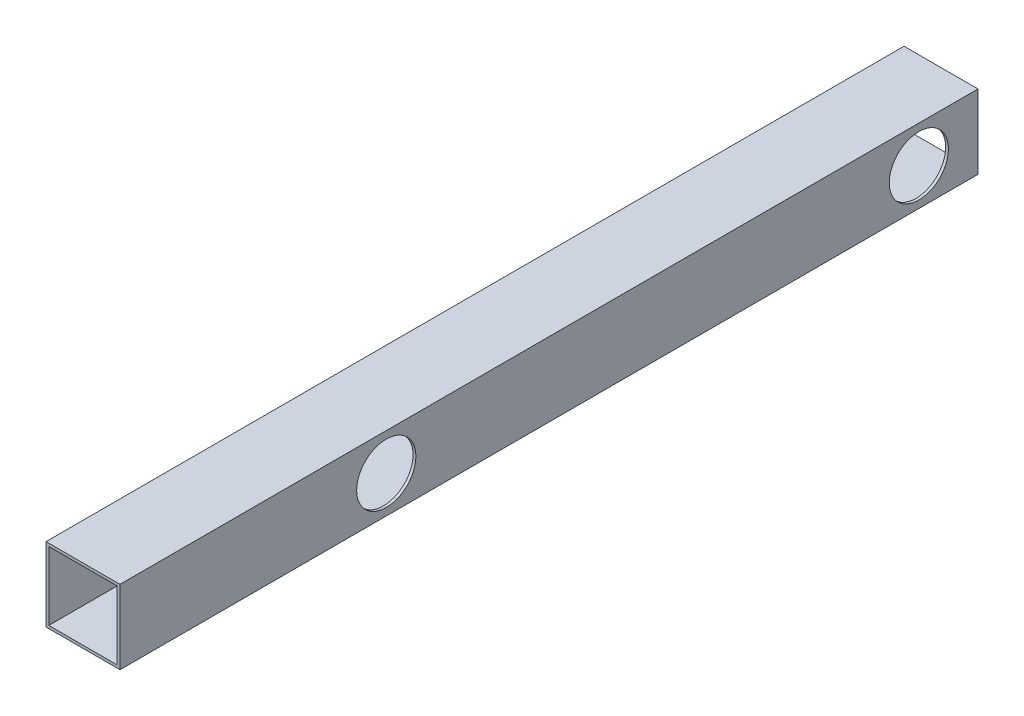
ISO-10303-21;
HEADER;
FILE_DESCRIPTION(('STEP AP214'),'2;1');
FILE_NAME('part.step','',(''),(''),'','','');
FILE_SCHEMA(('AUTOMOTIVE_DESIGN { 1 0 10303 214 1 1 1 1 }'));
ENDSEC;
DATA;
#1=APPLICATION_CONTEXT('core data for automotive mechanical design processes');
#2=APPLICATION_PROTOCOL_DEFINITION('international standard','automotive_design',2000,#1);
#3=PRODUCT_CONTEXT('',#1,'mechanical');
#4=PRODUCT('Part','Part','',(#3));
#5=PRODUCT_RELATED_PRODUCT_CATEGORY('part','',(#4));
#6=PRODUCT_DEFINITION_FORMATION('','',#4);
#7=PRODUCT_DEFINITION_CONTEXT('part definition',#1,'design');
#8=PRODUCT_DEFINITION('design','',#6,#7);
#9=PRODUCT_DEFINITION_SHAPE('','',#8);
#10=(LENGTH_UNIT() NAMED_UNIT(*) SI_UNIT(.MILLI.,.METRE.));
#11=(NAMED_UNIT(*) PLANE_ANGLE_UNIT() SI_UNIT($,.RADIAN.));
#12=(NAMED_UNIT(*) SI_UNIT($,.STERADIAN.) SOLID_ANGLE_UNIT());
#13=UNCERTAINTY_MEASURE_WITH_UNIT(LENGTH_MEASURE(1.E-05),#10,'distance_accuracy_value','');
#14=(GEOMETRIC_REPRESENTATION_CONTEXT(3) GLOBAL_UNCERTAINTY_ASSIGNED_CONTEXT((#13)) GLOBAL_UNIT_ASSIGNED_CONTEXT((#10,
#11,#12)) REPRESENTATION_CONTEXT('',''));
#15=CARTESIAN_POINT('',(0.,0.,0.));
#16=DIRECTION('',(0.,0.,1.));
#17=DIRECTION('',(1.,0.,0.));
#18=AXIS2_PLACEMENT_3D('',#15,#16,#17);
#19=CARTESIAN_POINT('',(31.75,-31.75,-304.8));
#20=DIRECTION('',(1.,0.,0.));
#21=DIRECTION('',(0.,0.,-1.));
#22=AXIS2_PLACEMENT_3D('',#19,#20,#21);
#23=PLANE('',#22);
#24=CARTESIAN_POINT('',(31.75,0.,-254.));
#25=DIRECTION('',(-1.,0.,0.));
#26=DIRECTION('',(0.,0.,1.));
#27=AXIS2_PLACEMENT_3D('',#24,#25,#26);
#28=CIRCLE('',#27,25.4);
#29=CARTESIAN_POINT('',(31.75,0.,-228.6));
#30=VERTEX_POINT('',#29);
#31=EDGE_CURVE('E201',#30,#30,#28,.T.);
#32=ORIENTED_EDGE('',*,*,#31,.T.);
#33=EDGE_LOOP('',(#32));
#34=FACE_BOUND('',#33,.T.);
#35=CARTESIAN_POINT('',(31.75,0.,203.2));
#36=DIRECTION('',(-1.,0.,0.));
#37=DIRECTION('',(0.,0.,1.));
#38=AXIS2_PLACEMENT_3D('',#35,#36,#37);
#39=CIRCLE('',#38,25.4000000000001);
#40=CARTESIAN_POINT('',(31.75,0.,228.6));
#41=VERTEX_POINT('',#40);
#42=EDGE_CURVE('E215',#41,#41,#39,.T.);
#43=ORIENTED_EDGE('',*,*,#42,.T.);
#44=EDGE_LOOP('',(#43));
#45=FACE_BOUND('',#44,.T.);
#46=DIRECTION('',(0.,0.,1.));
#47=VECTOR('',#46,1.);
#48=CARTESIAN_POINT('',(31.75,31.75,-304.8));
#49=LINE('',#48,#47);
#50=CARTESIAN_POINT('',(31.75,31.75,-304.8));
#51=VERTEX_POINT('',#50);
#52=CARTESIAN_POINT('',(31.75,31.75,431.8));
#53=VERTEX_POINT('',#52);
#54=EDGE_CURVE('E189',#51,#53,#49,.T.);
#55=ORIENTED_EDGE('',*,*,#54,.T.);
#56=DIRECTION('',(0.,1.,0.));
#57=VECTOR('',#56,1.);
#58=CARTESIAN_POINT('',(31.75,-31.75,431.8));
#59=LINE('',#58,#57);
#60=CARTESIAN_POINT('',(31.75,-31.75,431.8));
#61=VERTEX_POINT('',#60);
#62=EDGE_CURVE('E142',#61,#53,#59,.T.);
#63=ORIENTED_EDGE('',*,*,#62,.F.);
#64=DIRECTION('',(0.,0.,1.));
#65=VECTOR('',#64,1.);
#66=CARTESIAN_POINT('',(31.75,-31.75,-304.8));
#67=LINE('',#66,#65);
#68=CARTESIAN_POINT('',(31.75,-31.75,-304.8));
#69=VERTEX_POINT('',#68);
#70=EDGE_CURVE('E11',#69,#61,#67,.T.);
#71=ORIENTED_EDGE('',*,*,#70,.F.);
#72=DIRECTION('',(0.,1.,0.));
#73=VECTOR('',#72,1.);
#74=CARTESIAN_POINT('',(31.75,-31.75,-304.8));
#75=LINE('',#74,#73);
#76=EDGE_CURVE('E170',#69,#51,#75,.T.);
#77=ORIENTED_EDGE('',*,*,#76,.T.);
#78=EDGE_LOOP('',(#55,#63,#71,#77));
#79=FACE_BOUND('',#78,.T.);
#80=ADVANCED_FACE('F39',(#34,#45,#79),#23,.T.);
#81=CARTESIAN_POINT('',(-31.75,-31.75,-304.8));
#82=DIRECTION('',(0.,-1.,0.));
#83=DIRECTION('',(0.,0.,-1.));
#84=AXIS2_PLACEMENT_3D('',#81,#82,#83);
#85=PLANE('',#84);
#86=ORIENTED_EDGE('',*,*,#70,.T.);
#87=DIRECTION('',(1.,0.,0.));
#88=VECTOR('',#87,1.);
#89=CARTESIAN_POINT('',(-31.75,-31.75,431.8));
#90=LINE('',#89,#88);
#91=CARTESIAN_POINT('',(-31.75,-31.75,431.8));
#92=VERTEX_POINT('',#91);
#93=EDGE_CURVE('E154',#92,#61,#90,.T.);
#94=ORIENTED_EDGE('',*,*,#93,.F.);
#95=DIRECTION('',(0.,0.,1.));
#96=VECTOR('',#95,1.);
#97=CARTESIAN_POINT('',(-31.75,-31.75,-304.8));
#98=LINE('',#97,#96);
#99=CARTESIAN_POINT('',(-31.75,-31.75,-304.8));
#100=VERTEX_POINT('',#99);
#101=EDGE_CURVE('E48',#100,#92,#98,.T.);
#102=ORIENTED_EDGE('',*,*,#101,.F.);
#103=DIRECTION('',(1.,0.,0.));
#104=VECTOR('',#103,1.);
#105=CARTESIAN_POINT('',(-31.75,-31.75,-304.8));
#106=LINE('',#105,#104);
#107=EDGE_CURVE('E186',#100,#69,#106,.T.);
#108=ORIENTED_EDGE('',*,*,#107,.T.);
#109=EDGE_LOOP('',(#86,#94,#102,#108));
#110=FACE_BOUND('',#109,.T.);
#111=ADVANCED_FACE('F251',(#110),#85,.T.);
#112=CARTESIAN_POINT('',(-31.75,-31.75,-304.8));
#113=DIRECTION('',(-1.,0.,0.));
#114=DIRECTION('',(0.,0.,1.));
#115=AXIS2_PLACEMENT_3D('',#112,#113,#114);
#116=PLANE('',#115);
#117=CARTESIAN_POINT('',(-31.75,0.,-254.));
#118=DIRECTION('',(-1.,0.,0.));
#119=DIRECTION('',(0.,0.,1.));
#120=AXIS2_PLACEMENT_3D('',#117,#118,#119);
#121=CIRCLE('',#120,25.4);
#122=CARTESIAN_POINT('',(-31.75,0.,-228.6));
#123=VERTEX_POINT('',#122);
#124=EDGE_CURVE('E209',#123,#123,#121,.T.);
#125=ORIENTED_EDGE('',*,*,#124,.F.);
#126=EDGE_LOOP('',(#125));
#127=FACE_BOUND('',#126,.T.);
#128=CARTESIAN_POINT('',(-31.75,0.,203.2));
#129=DIRECTION('',(-1.,0.,0.));
#130=DIRECTION('',(0.,0.,1.));
#131=AXIS2_PLACEMENT_3D('',#128,#129,#130);
#132=CIRCLE('',#131,25.4000000000001);
#133=CARTESIAN_POINT('',(-31.75,0.,228.6));
#134=VERTEX_POINT('',#133);
#135=EDGE_CURVE('E221',#134,#134,#132,.T.);
#136=ORIENTED_EDGE('',*,*,#135,.F.);
#137=EDGE_LOOP('',(#136));
#138=FACE_BOUND('',#137,.T.);
#139=ORIENTED_EDGE('',*,*,#101,.T.);
#140=DIRECTION('',(0.,-1.,0.));
#141=VECTOR('',#140,1.);
#142=CARTESIAN_POINT('',(-31.75,-31.75,431.8));
#143=LINE('',#142,#141);
#144=CARTESIAN_POINT('',(-31.75,31.75,431.8));
#145=VERTEX_POINT('',#144);
#146=EDGE_CURVE('E150',#145,#92,#143,.T.);
#147=ORIENTED_EDGE('',*,*,#146,.F.);
#148=DIRECTION('',(0.,0.,1.));
#149=VECTOR('',#148,1.);
#150=CARTESIAN_POINT('',(-31.75,31.75,-304.8));
#151=LINE('',#150,#149);
#152=CARTESIAN_POINT('',(-31.75,31.75,-304.8));
#153=VERTEX_POINT('',#152);
#154=EDGE_CURVE('E193',#153,#145,#151,.T.);
#155=ORIENTED_EDGE('',*,*,#154,.F.);
#156=DIRECTION('',(0.,-1.,0.));
#157=VECTOR('',#156,1.);
#158=CARTESIAN_POINT('',(-31.75,-31.75,-304.8));
#159=LINE('',#158,#157);
#160=EDGE_CURVE('E182',#153,#100,#159,.T.);
#161=ORIENTED_EDGE('',*,*,#160,.T.);
#162=EDGE_LOOP('',(#139,#147,#155,#161));
#163=FACE_BOUND('',#162,.T.);
#164=ADVANCED_FACE('F255',(#127,#138,#163),#116,.T.);
#165=CARTESIAN_POINT('',(-31.75,31.75,-304.8));
#166=DIRECTION('',(0.,1.,0.));
#167=DIRECTION('',(0.,0.,1.));
#168=AXIS2_PLACEMENT_3D('',#165,#166,#167);
#169=PLANE('',#168);
#170=ORIENTED_EDGE('',*,*,#154,.T.);
#171=DIRECTION('',(-1.,0.,0.));
#172=VECTOR('',#171,1.);
#173=CARTESIAN_POINT('',(-31.75,31.75,431.8));
#174=LINE('',#173,#172);
#175=EDGE_CURVE('E146',#53,#145,#174,.T.);
#176=ORIENTED_EDGE('',*,*,#175,.F.);
#177=ORIENTED_EDGE('',*,*,#54,.F.);
#178=DIRECTION('',(-1.,0.,0.));
#179=VECTOR('',#178,1.);
#180=CARTESIAN_POINT('',(-31.75,31.75,-304.8));
#181=LINE('',#180,#179);
#182=EDGE_CURVE('E178',#51,#153,#181,.T.);
#183=ORIENTED_EDGE('',*,*,#182,.T.);
#184=EDGE_LOOP('',(#170,#176,#177,#183));
#185=FACE_BOUND('',#184,.T.);
#186=ADVANCED_FACE('F263',(#185),#169,.T.);
#187=CARTESIAN_POINT('',(0.,0.,-304.8));
#188=DIRECTION('',(0.,0.,-1.));
#189=DIRECTION('',(-1.,0.,0.));
#190=AXIS2_PLACEMENT_3D('',#187,#188,#189);
#191=PLANE('',#190);
#192=DIRECTION('',(0.,1.,0.));
#193=VECTOR('',#192,1.);
#194=CARTESIAN_POINT('',(29.36875,-29.36875,-304.8));
#195=LINE('',#194,#193);
#196=CARTESIAN_POINT('',(29.36875,-29.36875,-304.8));
#197=VERTEX_POINT('',#196);
#198=CARTESIAN_POINT('',(29.36875,29.36875,-304.8));
#199=VERTEX_POINT('',#198);
#200=EDGE_CURVE('E158',#197,#199,#195,.T.);
#201=ORIENTED_EDGE('',*,*,#200,.T.);
#202=DIRECTION('',(-1.,0.,0.));
#203=VECTOR('',#202,1.);
#204=CARTESIAN_POINT('',(-29.36875,29.36875,-304.8));
#205=LINE('',#204,#203);
#206=CARTESIAN_POINT('',(-29.36875,29.36875,-304.8));
#207=VERTEX_POINT('',#206);
#208=EDGE_CURVE('E112',#199,#207,#205,.T.);
#209=ORIENTED_EDGE('',*,*,#208,.T.);
#210=DIRECTION('',(0.,-1.,0.));
#211=VECTOR('',#210,1.);
#212=CARTESIAN_POINT('',(-29.36875,-29.36875,-304.8));
#213=LINE('',#212,#211);
#214=CARTESIAN_POINT('',(-29.36875,-29.36875,-304.8));
#215=VERTEX_POINT('',#214);
#216=EDGE_CURVE('E56',#207,#215,#213,.T.);
#217=ORIENTED_EDGE('',*,*,#216,.T.);
#218=DIRECTION('',(1.,0.,0.));
#219=VECTOR('',#218,1.);
#220=CARTESIAN_POINT('',(-29.36875,-29.36875,-304.8));
#221=LINE('',#220,#219);
#222=EDGE_CURVE('E118',#215,#197,#221,.T.);
#223=ORIENTED_EDGE('',*,*,#222,.T.);
#224=EDGE_LOOP('',(#201,#209,#217,#223));
#225=FACE_BOUND('',#224,.T.);
#226=ORIENTED_EDGE('',*,*,#76,.F.);
#227=ORIENTED_EDGE('',*,*,#107,.F.);
#228=ORIENTED_EDGE('',*,*,#160,.F.);
#229=ORIENTED_EDGE('',*,*,#182,.F.);
#230=EDGE_LOOP('',(#226,#227,#228,#229));
#231=FACE_BOUND('',#230,.T.);
#232=ADVANCED_FACE('F270',(#225,#231),#191,.T.);
#233=CARTESIAN_POINT('',(29.36875,-29.36875,-304.8));
#234=DIRECTION('',(1.,0.,0.));
#235=DIRECTION('',(0.,0.,-1.));
#236=AXIS2_PLACEMENT_3D('',#233,#234,#235);
#237=PLANE('',#236);
#238=CARTESIAN_POINT('',(29.36875,0.,-254.));
#239=DIRECTION('',(1.,0.,0.));
#240=DIRECTION('',(0.,0.,-1.));
#241=AXIS2_PLACEMENT_3D('',#238,#239,#240);
#242=CIRCLE('',#241,25.4);
#243=CARTESIAN_POINT('',(29.36875,0.,-279.4));
#244=VERTEX_POINT('',#243);
#245=EDGE_CURVE('E128',#244,#244,#242,.T.);
#246=ORIENTED_EDGE('',*,*,#245,.T.);
#247=EDGE_LOOP('',(#246));
#248=FACE_BOUND('',#247,.T.);
#249=CARTESIAN_POINT('',(29.36875,0.,203.2));
#250=DIRECTION('',(1.,0.,0.));
#251=DIRECTION('',(0.,0.,-1.));
#252=AXIS2_PLACEMENT_3D('',#249,#250,#251);
#253=CIRCLE('',#252,25.4000000000001);
#254=CARTESIAN_POINT('',(29.36875,0.,177.8));
#255=VERTEX_POINT('',#254);
#256=EDGE_CURVE('E200',#255,#255,#253,.T.);
#257=ORIENTED_EDGE('',*,*,#256,.T.);
#258=EDGE_LOOP('',(#257));
#259=FACE_BOUND('',#258,.T.);
#260=DIRECTION('',(0.,0.,1.));
#261=VECTOR('',#260,1.);
#262=CARTESIAN_POINT('',(29.36875,-29.36875,-304.8));
#263=LINE('',#262,#261);
#264=CARTESIAN_POINT('',(29.36875,-29.36875,431.8));
#265=VERTEX_POINT('',#264);
#266=EDGE_CURVE('E123',#197,#265,#263,.T.);
#267=ORIENTED_EDGE('',*,*,#266,.T.);
#268=DIRECTION('',(0.,1.,0.));
#269=VECTOR('',#268,1.);
#270=CARTESIAN_POINT('',(29.36875,-29.36875,431.8));
#271=LINE('',#270,#269);
#272=CARTESIAN_POINT('',(29.36875,29.36875,431.8));
#273=VERTEX_POINT('',#272);
#274=EDGE_CURVE('E121',#265,#273,#271,.T.);
#275=ORIENTED_EDGE('',*,*,#274,.T.);
#276=DIRECTION('',(0.,0.,1.));
#277=VECTOR('',#276,1.);
#278=CARTESIAN_POINT('',(29.36875,29.36875,-304.8));
#279=LINE('',#278,#277);
#280=EDGE_CURVE('E105',#199,#273,#279,.T.);
#281=ORIENTED_EDGE('',*,*,#280,.F.);
#282=ORIENTED_EDGE('',*,*,#200,.F.);
#283=EDGE_LOOP('',(#267,#275,#281,#282));
#284=FACE_BOUND('',#283,.T.);
#285=ADVANCED_FACE('F122',(#248,#259,#284),#237,.F.);
#286=CARTESIAN_POINT('',(-29.36875,-29.36875,-304.8));
#287=DIRECTION('',(0.,-1.,0.));
#288=DIRECTION('',(0.,0.,-1.));
#289=AXIS2_PLACEMENT_3D('',#286,#287,#288);
#290=PLANE('',#289);
#291=DIRECTION('',(0.,0.,1.));
#292=VECTOR('',#291,1.);
#293=CARTESIAN_POINT('',(-29.36875,-29.36875,-304.8));
#294=LINE('',#293,#292);
#295=CARTESIAN_POINT('',(-29.36875,-29.36875,431.8));
#296=VERTEX_POINT('',#295);
#297=EDGE_CURVE('E171',#215,#296,#294,.T.);
#298=ORIENTED_EDGE('',*,*,#297,.T.);
#299=DIRECTION('',(1.,0.,0.));
#300=VECTOR('',#299,1.);
#301=CARTESIAN_POINT('',(-29.36875,-29.36875,431.8));
#302=LINE('',#301,#300);
#303=EDGE_CURVE('E136',#296,#265,#302,.T.);
#304=ORIENTED_EDGE('',*,*,#303,.T.);
#305=ORIENTED_EDGE('',*,*,#266,.F.);
#306=ORIENTED_EDGE('',*,*,#222,.F.);
#307=EDGE_LOOP('',(#298,#304,#305,#306));
#308=FACE_BOUND('',#307,.T.);
#309=ADVANCED_FACE('F286',(#308),#290,.F.);
#310=CARTESIAN_POINT('',(-29.36875,-29.36875,-304.8));
#311=DIRECTION('',(-1.,0.,0.));
#312=DIRECTION('',(0.,0.,1.));
#313=AXIS2_PLACEMENT_3D('',#310,#311,#312);
#314=PLANE('',#313);
#315=CARTESIAN_POINT('',(-29.36875,0.,-254.));
#316=DIRECTION('',(-1.,0.,0.));
#317=DIRECTION('',(0.,0.,1.));
#318=AXIS2_PLACEMENT_3D('',#315,#316,#317);
#319=CIRCLE('',#318,25.4);
#320=CARTESIAN_POINT('',(-29.36875,0.,-228.6));
#321=VERTEX_POINT('',#320);
#322=EDGE_CURVE('E42',#321,#321,#319,.T.);
#323=ORIENTED_EDGE('',*,*,#322,.T.);
#324=EDGE_LOOP('',(#323));
#325=FACE_BOUND('',#324,.T.);
#326=CARTESIAN_POINT('',(-29.36875,0.,203.2));
#327=DIRECTION('',(-1.,0.,0.));
#328=DIRECTION('',(0.,0.,1.));
#329=AXIS2_PLACEMENT_3D('',#326,#327,#328);
#330=CIRCLE('',#329,25.4000000000001);
#331=CARTESIAN_POINT('',(-29.36875,0.,228.6));
#332=VERTEX_POINT('',#331);
#333=EDGE_CURVE('E197',#332,#332,#330,.T.);
#334=ORIENTED_EDGE('',*,*,#333,.T.);
#335=EDGE_LOOP('',(#334));
#336=FACE_BOUND('',#335,.T.);
#337=DIRECTION('',(0.,0.,1.));
#338=VECTOR('',#337,1.);
#339=CARTESIAN_POINT('',(-29.36875,29.36875,-304.8));
#340=LINE('',#339,#338);
#341=CARTESIAN_POINT('',(-29.36875,29.36875,431.8));
#342=VERTEX_POINT('',#341);
#343=EDGE_CURVE('E117',#207,#342,#340,.T.);
#344=ORIENTED_EDGE('',*,*,#343,.T.);
#345=DIRECTION('',(0.,-1.,0.));
#346=VECTOR('',#345,1.);
#347=CARTESIAN_POINT('',(-29.36875,-29.36875,431.8));
#348=LINE('',#347,#346);
#349=EDGE_CURVE('E132',#342,#296,#348,.T.);
#350=ORIENTED_EDGE('',*,*,#349,.T.);
#351=ORIENTED_EDGE('',*,*,#297,.F.);
#352=ORIENTED_EDGE('',*,*,#216,.F.);
#353=EDGE_LOOP('',(#344,#350,#351,#352));
#354=FACE_BOUND('',#353,.T.);
#355=ADVANCED_FACE('F232',(#325,#336,#354),#314,.F.);
#356=CARTESIAN_POINT('',(-29.36875,29.36875,-304.8));
#357=DIRECTION('',(0.,1.,0.));
#358=DIRECTION('',(0.,0.,1.));
#359=AXIS2_PLACEMENT_3D('',#356,#357,#358);
#360=PLANE('',#359);
#361=ORIENTED_EDGE('',*,*,#280,.T.);
#362=DIRECTION('',(-1.,0.,0.));
#363=VECTOR('',#362,1.);
#364=CARTESIAN_POINT('',(-29.36875,29.36875,431.8));
#365=LINE('',#364,#363);
#366=EDGE_CURVE('E109',#273,#342,#365,.T.);
#367=ORIENTED_EDGE('',*,*,#366,.T.);
#368=ORIENTED_EDGE('',*,*,#343,.F.);
#369=ORIENTED_EDGE('',*,*,#208,.F.);
#370=EDGE_LOOP('',(#361,#367,#368,#369));
#371=FACE_BOUND('',#370,.T.);
#372=ADVANCED_FACE('F107',(#371),#360,.F.);
#373=CARTESIAN_POINT('',(0.,0.,431.8));
#374=DIRECTION('',(0.,0.,-1.));
#375=DIRECTION('',(-1.,0.,0.));
#376=AXIS2_PLACEMENT_3D('',#373,#374,#375);
#377=PLANE('',#376);
#378=ORIENTED_EDGE('',*,*,#62,.T.);
#379=ORIENTED_EDGE('',*,*,#175,.T.);
#380=ORIENTED_EDGE('',*,*,#146,.T.);
#381=ORIENTED_EDGE('',*,*,#93,.T.);
#382=EDGE_LOOP('',(#378,#379,#380,#381));
#383=FACE_BOUND('',#382,.T.);
#384=ORIENTED_EDGE('',*,*,#274,.F.);
#385=ORIENTED_EDGE('',*,*,#303,.F.);
#386=ORIENTED_EDGE('',*,*,#349,.F.);
#387=ORIENTED_EDGE('',*,*,#366,.F.);
#388=EDGE_LOOP('',(#384,#385,#386,#387));
#389=FACE_BOUND('',#388,.T.);
#390=ADVANCED_FACE('F130',(#383,#389),#377,.F.);
#391=CARTESIAN_POINT('',(31.75,0.,203.2));
#392=DIRECTION('',(-1.,0.,0.));
#393=DIRECTION('',(0.,0.,1.));
#394=AXIS2_PLACEMENT_3D('',#391,#392,#393);
#395=CYLINDRICAL_SURFACE('',#394,25.4000000000001);
#396=ORIENTED_EDGE('',*,*,#135,.T.);
#397=EDGE_LOOP('',(#396));
#398=FACE_BOUND('',#397,.T.);
#399=ORIENTED_EDGE('',*,*,#333,.F.);
#400=EDGE_LOOP('',(#399));
#401=FACE_BOUND('',#400,.T.);
#402=ADVANCED_FACE('F237',(#398,#401),#395,.F.);
#403=CARTESIAN_POINT('',(31.75,0.,-254.));
#404=DIRECTION('',(-1.,0.,0.));
#405=DIRECTION('',(0.,0.,1.));
#406=AXIS2_PLACEMENT_3D('',#403,#404,#405);
#407=CYLINDRICAL_SURFACE('',#406,25.4);
#408=ORIENTED_EDGE('',*,*,#124,.T.);
#409=EDGE_LOOP('',(#408));
#410=FACE_BOUND('',#409,.T.);
#411=ORIENTED_EDGE('',*,*,#322,.F.);
#412=EDGE_LOOP('',(#411));
#413=FACE_BOUND('',#412,.T.);
#414=ADVANCED_FACE('F234',(#410,#413),#407,.F.);
#415=ORIENTED_EDGE('',*,*,#42,.F.);
#416=EDGE_LOOP('',(#415));
#417=FACE_BOUND('',#416,.T.);
#418=ORIENTED_EDGE('',*,*,#256,.F.);
#419=EDGE_LOOP('',(#418));
#420=FACE_BOUND('',#419,.T.);
#421=ADVANCED_FACE('F236',(#417,#420),#395,.F.);
#422=ORIENTED_EDGE('',*,*,#31,.F.);
#423=EDGE_LOOP('',(#422));
#424=FACE_BOUND('',#423,.T.);
#425=ORIENTED_EDGE('',*,*,#245,.F.);
#426=EDGE_LOOP('',(#425));
#427=FACE_BOUND('',#426,.T.);
#428=ADVANCED_FACE('F240',(#424,#427),#407,.F.);
#429=CLOSED_SHELL('',(#80,#111,#164,#186,#232,#285,#309,#355,#372,#390,#402,#414,#421,#428));
#430=MANIFOLD_SOLID_BREP('B2',#429);
#431=ADVANCED_BREP_SHAPE_REPRESENTATION('',(#18,#430),#14);
#432=SHAPE_DEFINITION_REPRESENTATION(#9,#431);
ENDSEC;
END-ISO-10303-21;
